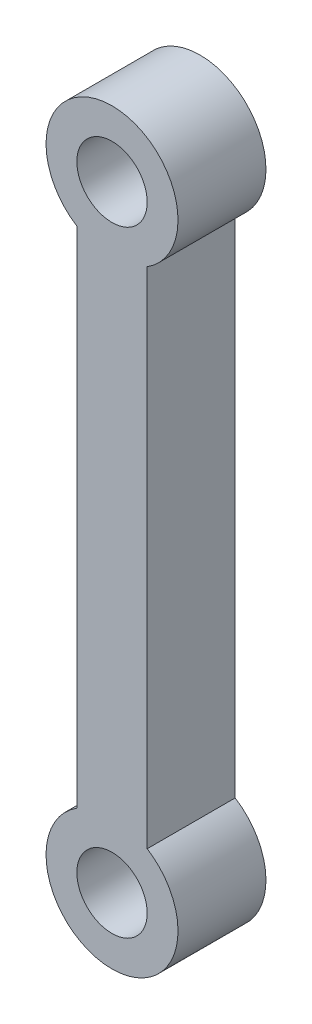
ISO-10303-21;
HEADER;
FILE_DESCRIPTION(('STEP AP214'),'2;1');
FILE_NAME('part.step','',(''),(''),'','','');
FILE_SCHEMA(('AUTOMOTIVE_DESIGN { 1 0 10303 214 1 1 1 1 }'));
ENDSEC;
DATA;
#1=APPLICATION_CONTEXT('core data for automotive mechanical design processes');
#2=APPLICATION_PROTOCOL_DEFINITION('international standard','automotive_design',2000,#1);
#3=PRODUCT_CONTEXT('',#1,'mechanical');
#4=PRODUCT('Part','Part','',(#3));
#5=PRODUCT_RELATED_PRODUCT_CATEGORY('part','',(#4));
#6=PRODUCT_DEFINITION_FORMATION('','',#4);
#7=PRODUCT_DEFINITION_CONTEXT('part definition',#1,'design');
#8=PRODUCT_DEFINITION('design','',#6,#7);
#9=PRODUCT_DEFINITION_SHAPE('','',#8);
#10=(LENGTH_UNIT() NAMED_UNIT(*) SI_UNIT(.MILLI.,.METRE.));
#11=(NAMED_UNIT(*) PLANE_ANGLE_UNIT() SI_UNIT($,.RADIAN.));
#12=(NAMED_UNIT(*) SI_UNIT($,.STERADIAN.) SOLID_ANGLE_UNIT());
#13=UNCERTAINTY_MEASURE_WITH_UNIT(LENGTH_MEASURE(1.E-05),#10,'distance_accuracy_value','');
#14=(GEOMETRIC_REPRESENTATION_CONTEXT(3) GLOBAL_UNCERTAINTY_ASSIGNED_CONTEXT((#13)) GLOBAL_UNIT_ASSIGNED_CONTEXT((#10,
#11,#12)) REPRESENTATION_CONTEXT('',''));
#15=CARTESIAN_POINT('',(0.,0.,0.));
#16=DIRECTION('',(0.,0.,1.));
#17=DIRECTION('',(1.,0.,0.));
#18=AXIS2_PLACEMENT_3D('',#15,#16,#17);
#19=CARTESIAN_POINT('',(0.,70.,10.));
#20=DIRECTION('',(0.,0.,1.));
#21=DIRECTION('',(1.,0.,0.));
#22=AXIS2_PLACEMENT_3D('',#19,#20,#21);
#23=PLANE('',#22);
#24=CARTESIAN_POINT('',(0.,70.,10.));
#25=DIRECTION('',(0.,0.,1.));
#26=DIRECTION('',(1.,0.,0.));
#27=AXIS2_PLACEMENT_3D('',#24,#25,#26);
#28=CIRCLE('',#27,4.00000000000001);
#29=CARTESIAN_POINT('',(4.00000000000001,70.,10.));
#30=VERTEX_POINT('',#29);
#31=EDGE_CURVE('E100',#30,#30,#28,.T.);
#32=ORIENTED_EDGE('',*,*,#31,.F.);
#33=EDGE_LOOP('',(#32));
#34=FACE_BOUND('',#33,.T.);
#35=CARTESIAN_POINT('',(0.,70.,10.));
#36=DIRECTION('',(0.,0.,1.));
#37=DIRECTION('',(1.,0.,0.));
#38=AXIS2_PLACEMENT_3D('',#35,#36,#37);
#39=CIRCLE('',#38,7.5);
#40=CARTESIAN_POINT('',(4.,63.6557112297752,10.));
#41=VERTEX_POINT('',#40);
#42=CARTESIAN_POINT('',(-4.,63.6557112297752,10.));
#43=VERTEX_POINT('',#42);
#44=EDGE_CURVE('E85',#41,#43,#39,.T.);
#45=ORIENTED_EDGE('',*,*,#44,.T.);
#46=DIRECTION('',(0.,-1.,0.));
#47=VECTOR('',#46,1.);
#48=CARTESIAN_POINT('',(-4.,63.6557112297752,10.));
#49=LINE('',#48,#47);
#50=CARTESIAN_POINT('',(-3.99999999999999,6.34428877022475,10.));
#51=VERTEX_POINT('',#50);
#52=EDGE_CURVE('E80',#43,#51,#49,.T.);
#53=ORIENTED_EDGE('',*,*,#52,.T.);
#54=CARTESIAN_POINT('',(0.,0.,10.));
#55=DIRECTION('',(0.,0.,1.));
#56=DIRECTION('',(1.,0.,0.));
#57=AXIS2_PLACEMENT_3D('',#54,#55,#56);
#58=CIRCLE('',#57,7.49999999999999);
#59=CARTESIAN_POINT('',(4.00000000000001,6.34428877022475,10.));
#60=VERTEX_POINT('',#59);
#61=EDGE_CURVE('E83',#51,#60,#58,.T.);
#62=ORIENTED_EDGE('',*,*,#61,.T.);
#63=DIRECTION('',(0.,1.,0.));
#64=VECTOR('',#63,1.);
#65=CARTESIAN_POINT('',(4.,63.6557112297752,10.));
#66=LINE('',#65,#64);
#67=EDGE_CURVE('E50',#60,#41,#66,.T.);
#68=ORIENTED_EDGE('',*,*,#67,.T.);
#69=EDGE_LOOP('',(#45,#53,#62,#68));
#70=FACE_BOUND('',#69,.T.);
#71=CARTESIAN_POINT('',(0.,0.,10.));
#72=DIRECTION('',(0.,0.,1.));
#73=DIRECTION('',(1.,0.,0.));
#74=AXIS2_PLACEMENT_3D('',#71,#72,#73);
#75=CIRCLE('',#74,4.);
#76=CARTESIAN_POINT('',(4.,0.,10.));
#77=VERTEX_POINT('',#76);
#78=EDGE_CURVE('E115',#77,#77,#75,.T.);
#79=ORIENTED_EDGE('',*,*,#78,.F.);
#80=EDGE_LOOP('',(#79));
#81=FACE_BOUND('',#80,.T.);
#82=ADVANCED_FACE('F33',(#34,#70,#81),#23,.T.);
#83=CARTESIAN_POINT('',(0.,70.,0.));
#84=DIRECTION('',(0.,0.,1.));
#85=DIRECTION('',(1.,0.,0.));
#86=AXIS2_PLACEMENT_3D('',#83,#84,#85);
#87=PLANE('',#86);
#88=CARTESIAN_POINT('',(0.,70.,0.));
#89=DIRECTION('',(0.,0.,1.));
#90=DIRECTION('',(1.,0.,0.));
#91=AXIS2_PLACEMENT_3D('',#88,#89,#90);
#92=CIRCLE('',#91,7.5);
#93=CARTESIAN_POINT('',(4.,63.6557112297752,0.));
#94=VERTEX_POINT('',#93);
#95=CARTESIAN_POINT('',(-4.,63.6557112297752,0.));
#96=VERTEX_POINT('',#95);
#97=EDGE_CURVE('E97',#94,#96,#92,.T.);
#98=ORIENTED_EDGE('',*,*,#97,.F.);
#99=DIRECTION('',(0.,1.,0.));
#100=VECTOR('',#99,1.);
#101=CARTESIAN_POINT('',(4.,63.6557112297752,0.));
#102=LINE('',#101,#100);
#103=CARTESIAN_POINT('',(4.00000000000001,6.34428877022475,0.));
#104=VERTEX_POINT('',#103);
#105=EDGE_CURVE('E73',#104,#94,#102,.T.);
#106=ORIENTED_EDGE('',*,*,#105,.F.);
#107=CARTESIAN_POINT('',(0.,0.,0.));
#108=DIRECTION('',(0.,0.,1.));
#109=DIRECTION('',(1.,0.,0.));
#110=AXIS2_PLACEMENT_3D('',#107,#108,#109);
#111=CIRCLE('',#110,7.49999999999999);
#112=CARTESIAN_POINT('',(-3.99999999999999,6.34428877022475,0.));
#113=VERTEX_POINT('',#112);
#114=EDGE_CURVE('E67',#113,#104,#111,.T.);
#115=ORIENTED_EDGE('',*,*,#114,.F.);
#116=DIRECTION('',(0.,-1.,0.));
#117=VECTOR('',#116,1.);
#118=CARTESIAN_POINT('',(-4.,63.6557112297752,0.));
#119=LINE('',#118,#117);
#120=EDGE_CURVE('E89',#96,#113,#119,.T.);
#121=ORIENTED_EDGE('',*,*,#120,.F.);
#122=EDGE_LOOP('',(#98,#106,#115,#121));
#123=FACE_BOUND('',#122,.T.);
#124=CARTESIAN_POINT('',(0.,70.,0.));
#125=DIRECTION('',(0.,0.,1.));
#126=DIRECTION('',(1.,0.,0.));
#127=AXIS2_PLACEMENT_3D('',#124,#125,#126);
#128=CIRCLE('',#127,4.00000000000001);
#129=CARTESIAN_POINT('',(4.00000000000001,70.,0.));
#130=VERTEX_POINT('',#129);
#131=EDGE_CURVE('E112',#130,#130,#128,.T.);
#132=ORIENTED_EDGE('',*,*,#131,.T.);
#133=EDGE_LOOP('',(#132));
#134=FACE_BOUND('',#133,.T.);
#135=CARTESIAN_POINT('',(0.,0.,0.));
#136=DIRECTION('',(0.,0.,1.));
#137=DIRECTION('',(1.,0.,0.));
#138=AXIS2_PLACEMENT_3D('',#135,#136,#137);
#139=CIRCLE('',#138,4.);
#140=CARTESIAN_POINT('',(4.,0.,0.));
#141=VERTEX_POINT('',#140);
#142=EDGE_CURVE('E118',#141,#141,#139,.T.);
#143=ORIENTED_EDGE('',*,*,#142,.T.);
#144=EDGE_LOOP('',(#143));
#145=FACE_BOUND('',#144,.T.);
#146=ADVANCED_FACE('F108',(#123,#134,#145),#87,.F.);
#147=CARTESIAN_POINT('',(0.,70.,10.));
#148=DIRECTION('',(0.,0.,-1.));
#149=DIRECTION('',(-1.,0.,0.));
#150=AXIS2_PLACEMENT_3D('',#147,#148,#149);
#151=CYLINDRICAL_SURFACE('',#150,7.5);
#152=ORIENTED_EDGE('',*,*,#97,.T.);
#153=DIRECTION('',(0.,0.,-1.));
#154=VECTOR('',#153,1.);
#155=CARTESIAN_POINT('',(-4.,63.6557112297752,10.));
#156=LINE('',#155,#154);
#157=EDGE_CURVE('E11',#43,#96,#156,.T.);
#158=ORIENTED_EDGE('',*,*,#157,.F.);
#159=ORIENTED_EDGE('',*,*,#44,.F.);
#160=DIRECTION('',(0.,0.,-1.));
#161=VECTOR('',#160,1.);
#162=CARTESIAN_POINT('',(4.,63.6557112297752,10.));
#163=LINE('',#162,#161);
#164=EDGE_CURVE('E93',#41,#94,#163,.T.);
#165=ORIENTED_EDGE('',*,*,#164,.T.);
#166=EDGE_LOOP('',(#152,#158,#159,#165));
#167=FACE_BOUND('',#166,.T.);
#168=ADVANCED_FACE('F35',(#167),#151,.T.);
#169=CARTESIAN_POINT('',(-4.,63.6557112297752,10.));
#170=DIRECTION('',(1.,0.,0.));
#171=DIRECTION('',(0.,1.,0.));
#172=AXIS2_PLACEMENT_3D('',#169,#170,#171);
#173=PLANE('',#172);
#174=ORIENTED_EDGE('',*,*,#120,.T.);
#175=DIRECTION('',(0.,0.,-1.));
#176=VECTOR('',#175,1.);
#177=CARTESIAN_POINT('',(-3.99999999999999,6.34428877022475,10.));
#178=LINE('',#177,#176);
#179=EDGE_CURVE('E42',#51,#113,#178,.T.);
#180=ORIENTED_EDGE('',*,*,#179,.F.);
#181=ORIENTED_EDGE('',*,*,#52,.F.);
#182=ORIENTED_EDGE('',*,*,#157,.T.);
#183=EDGE_LOOP('',(#174,#180,#181,#182));
#184=FACE_BOUND('',#183,.T.);
#185=ADVANCED_FACE('F88',(#184),#173,.F.);
#186=CARTESIAN_POINT('',(0.,0.,10.));
#187=DIRECTION('',(0.,0.,-1.));
#188=DIRECTION('',(-1.,0.,0.));
#189=AXIS2_PLACEMENT_3D('',#186,#187,#188);
#190=CYLINDRICAL_SURFACE('',#189,7.49999999999999);
#191=ORIENTED_EDGE('',*,*,#114,.T.);
#192=DIRECTION('',(0.,0.,-1.));
#193=VECTOR('',#192,1.);
#194=CARTESIAN_POINT('',(4.00000000000001,6.34428877022475,10.));
#195=LINE('',#194,#193);
#196=EDGE_CURVE('E90',#60,#104,#195,.T.);
#197=ORIENTED_EDGE('',*,*,#196,.F.);
#198=ORIENTED_EDGE('',*,*,#61,.F.);
#199=ORIENTED_EDGE('',*,*,#179,.T.);
#200=EDGE_LOOP('',(#191,#197,#198,#199));
#201=FACE_BOUND('',#200,.T.);
#202=ADVANCED_FACE('F91',(#201),#190,.T.);
#203=CARTESIAN_POINT('',(4.,63.6557112297752,10.));
#204=DIRECTION('',(-1.,0.,0.));
#205=DIRECTION('',(0.,-1.,0.));
#206=AXIS2_PLACEMENT_3D('',#203,#204,#205);
#207=PLANE('',#206);
#208=ORIENTED_EDGE('',*,*,#105,.T.);
#209=ORIENTED_EDGE('',*,*,#164,.F.);
#210=ORIENTED_EDGE('',*,*,#67,.F.);
#211=ORIENTED_EDGE('',*,*,#196,.T.);
#212=EDGE_LOOP('',(#208,#209,#210,#211));
#213=FACE_BOUND('',#212,.T.);
#214=ADVANCED_FACE('F105',(#213),#207,.F.);
#215=CARTESIAN_POINT('',(0.,70.,10.));
#216=DIRECTION('',(0.,0.,-1.));
#217=DIRECTION('',(-1.,0.,0.));
#218=AXIS2_PLACEMENT_3D('',#215,#216,#217);
#219=CYLINDRICAL_SURFACE('',#218,4.00000000000001);
#220=ORIENTED_EDGE('',*,*,#31,.T.);
#221=EDGE_LOOP('',(#220));
#222=FACE_BOUND('',#221,.T.);
#223=ORIENTED_EDGE('',*,*,#131,.F.);
#224=EDGE_LOOP('',(#223));
#225=FACE_BOUND('',#224,.T.);
#226=ADVANCED_FACE('F135',(#222,#225),#219,.F.);
#227=CARTESIAN_POINT('',(0.,0.,10.));
#228=DIRECTION('',(0.,0.,-1.));
#229=DIRECTION('',(-1.,0.,0.));
#230=AXIS2_PLACEMENT_3D('',#227,#228,#229);
#231=CYLINDRICAL_SURFACE('',#230,4.);
#232=ORIENTED_EDGE('',*,*,#78,.T.);
#233=EDGE_LOOP('',(#232));
#234=FACE_BOUND('',#233,.T.);
#235=ORIENTED_EDGE('',*,*,#142,.F.);
#236=EDGE_LOOP('',(#235));
#237=FACE_BOUND('',#236,.T.);
#238=ADVANCED_FACE('F124',(#234,#237),#231,.F.);
#239=CLOSED_SHELL('',(#82,#146,#168,#185,#202,#214,#226,#238));
#240=MANIFOLD_SOLID_BREP('B2',#239);
#241=ADVANCED_BREP_SHAPE_REPRESENTATION('',(#18,#240),#14);
#242=SHAPE_DEFINITION_REPRESENTATION(#9,#241);
ENDSEC;
END-ISO-10303-21;
